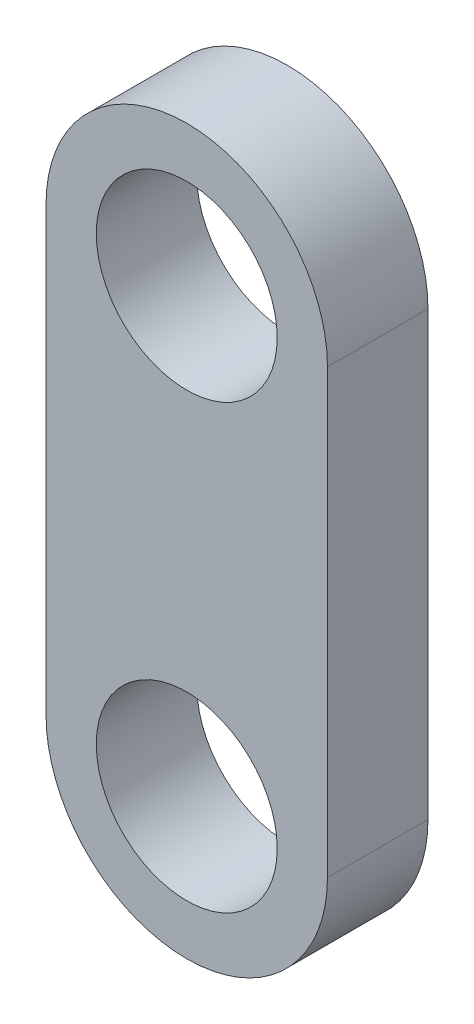
ISO-10303-21;
HEADER;
FILE_DESCRIPTION(('STEP AP214'),'2;1');
FILE_NAME('part.step','',(''),(''),'','','');
FILE_SCHEMA(('AUTOMOTIVE_DESIGN { 1 0 10303 214 1 1 1 1 }'));
ENDSEC;
DATA;
#1=APPLICATION_CONTEXT('core data for automotive mechanical design processes');
#2=APPLICATION_PROTOCOL_DEFINITION('international standard','automotive_design',2000,#1);
#3=PRODUCT_CONTEXT('',#1,'mechanical');
#4=PRODUCT('Part','Part','',(#3));
#5=PRODUCT_RELATED_PRODUCT_CATEGORY('part','',(#4));
#6=PRODUCT_DEFINITION_FORMATION('','',#4);
#7=PRODUCT_DEFINITION_CONTEXT('part definition',#1,'design');
#8=PRODUCT_DEFINITION('design','',#6,#7);
#9=PRODUCT_DEFINITION_SHAPE('','',#8);
#10=(LENGTH_UNIT() NAMED_UNIT(*) SI_UNIT(.MILLI.,.METRE.));
#11=(NAMED_UNIT(*) PLANE_ANGLE_UNIT() SI_UNIT($,.RADIAN.));
#12=(NAMED_UNIT(*) SI_UNIT($,.STERADIAN.) SOLID_ANGLE_UNIT());
#13=UNCERTAINTY_MEASURE_WITH_UNIT(LENGTH_MEASURE(1.E-05),#10,'distance_accuracy_value','');
#14=(GEOMETRIC_REPRESENTATION_CONTEXT(3) GLOBAL_UNCERTAINTY_ASSIGNED_CONTEXT((#13)) GLOBAL_UNIT_ASSIGNED_CONTEXT((#10,
#11,#12)) REPRESENTATION_CONTEXT('',''));
#15=CARTESIAN_POINT('',(0.,0.,0.));
#16=DIRECTION('',(0.,0.,1.));
#17=DIRECTION('',(1.,0.,0.));
#18=AXIS2_PLACEMENT_3D('',#15,#16,#17);
#19=CARTESIAN_POINT('',(0.,0.,2.5));
#20=DIRECTION('',(0.,0.,1.));
#21=DIRECTION('',(1.,0.,0.));
#22=AXIS2_PLACEMENT_3D('',#19,#20,#21);
#23=PLANE('',#22);
#24=CARTESIAN_POINT('',(0.,0.,2.5));
#25=DIRECTION('',(0.,0.,1.));
#26=DIRECTION('',(1.,0.,0.));
#27=AXIS2_PLACEMENT_3D('',#24,#25,#26);
#28=CIRCLE('',#27,2.25);
#29=CARTESIAN_POINT('',(2.25,0.,2.5));
#30=VERTEX_POINT('',#29);
#31=EDGE_CURVE('E112',#30,#30,#28,.T.);
#32=ORIENTED_EDGE('',*,*,#31,.F.);
#33=EDGE_LOOP('',(#32));
#34=FACE_BOUND('',#33,.T.);
#35=CARTESIAN_POINT('',(0.,0.,2.5));
#36=DIRECTION('',(0.,0.,1.));
#37=DIRECTION('',(1.,0.,0.));
#38=AXIS2_PLACEMENT_3D('',#35,#36,#37);
#39=CIRCLE('',#38,3.5);
#40=CARTESIAN_POINT('',(3.5,0.,2.5));
#41=VERTEX_POINT('',#40);
#42=CARTESIAN_POINT('',(-3.5,0.,2.5));
#43=VERTEX_POINT('',#42);
#44=EDGE_CURVE('E92',#41,#43,#39,.T.);
#45=ORIENTED_EDGE('',*,*,#44,.T.);
#46=DIRECTION('',(0.,-1.,0.));
#47=VECTOR('',#46,1.);
#48=CARTESIAN_POINT('',(-3.5,0.,2.5));
#49=LINE('',#48,#47);
#50=CARTESIAN_POINT('',(-3.5,-11.,2.5));
#51=VERTEX_POINT('',#50);
#52=EDGE_CURVE('E87',#43,#51,#49,.T.);
#53=ORIENTED_EDGE('',*,*,#52,.T.);
#54=CARTESIAN_POINT('',(0.,-11.,2.5));
#55=DIRECTION('',(0.,0.,1.));
#56=DIRECTION('',(-1.,0.,0.));
#57=AXIS2_PLACEMENT_3D('',#54,#55,#56);
#58=CIRCLE('',#57,3.5);
#59=CARTESIAN_POINT('',(3.5,-11.,2.5));
#60=VERTEX_POINT('',#59);
#61=EDGE_CURVE('E90',#51,#60,#58,.T.);
#62=ORIENTED_EDGE('',*,*,#61,.T.);
#63=DIRECTION('',(0.,1.,0.));
#64=VECTOR('',#63,1.);
#65=CARTESIAN_POINT('',(3.5,-11.,2.5));
#66=LINE('',#65,#64);
#67=EDGE_CURVE('E57',#60,#41,#66,.T.);
#68=ORIENTED_EDGE('',*,*,#67,.T.);
#69=EDGE_LOOP('',(#45,#53,#62,#68));
#70=FACE_BOUND('',#69,.T.);
#71=CARTESIAN_POINT('',(0.,-11.,2.5));
#72=DIRECTION('',(0.,0.,1.));
#73=DIRECTION('',(1.,0.,0.));
#74=AXIS2_PLACEMENT_3D('',#71,#72,#73);
#75=CIRCLE('',#74,2.25);
#76=CARTESIAN_POINT('',(2.25,-11.,2.5));
#77=VERTEX_POINT('',#76);
#78=EDGE_CURVE('E134',#77,#77,#75,.T.);
#79=ORIENTED_EDGE('',*,*,#78,.F.);
#80=EDGE_LOOP('',(#79));
#81=FACE_BOUND('',#80,.T.);
#82=ADVANCED_FACE('F39',(#34,#70,#81),#23,.T.);
#83=CARTESIAN_POINT('',(0.,0.,0.));
#84=DIRECTION('',(0.,0.,1.));
#85=DIRECTION('',(1.,0.,0.));
#86=AXIS2_PLACEMENT_3D('',#83,#84,#85);
#87=PLANE('',#86);
#88=CARTESIAN_POINT('',(0.,0.,0.));
#89=DIRECTION('',(0.,0.,1.));
#90=DIRECTION('',(1.,0.,0.));
#91=AXIS2_PLACEMENT_3D('',#88,#89,#90);
#92=CIRCLE('',#91,3.5);
#93=CARTESIAN_POINT('',(3.5,0.,0.));
#94=VERTEX_POINT('',#93);
#95=CARTESIAN_POINT('',(-3.5,0.,0.));
#96=VERTEX_POINT('',#95);
#97=EDGE_CURVE('E108',#94,#96,#92,.T.);
#98=ORIENTED_EDGE('',*,*,#97,.F.);
#99=DIRECTION('',(0.,1.,0.));
#100=VECTOR('',#99,1.);
#101=CARTESIAN_POINT('',(3.5,-11.,0.));
#102=LINE('',#101,#100);
#103=CARTESIAN_POINT('',(3.5,-11.,0.));
#104=VERTEX_POINT('',#103);
#105=EDGE_CURVE('E80',#104,#94,#102,.T.);
#106=ORIENTED_EDGE('',*,*,#105,.F.);
#107=CARTESIAN_POINT('',(0.,-11.,0.));
#108=DIRECTION('',(0.,0.,1.));
#109=DIRECTION('',(-1.,0.,0.));
#110=AXIS2_PLACEMENT_3D('',#107,#108,#109);
#111=CIRCLE('',#110,3.5);
#112=CARTESIAN_POINT('',(-3.5,-11.,0.));
#113=VERTEX_POINT('',#112);
#114=EDGE_CURVE('E74',#113,#104,#111,.T.);
#115=ORIENTED_EDGE('',*,*,#114,.F.);
#116=DIRECTION('',(0.,-1.,0.));
#117=VECTOR('',#116,1.);
#118=CARTESIAN_POINT('',(-3.5,0.,0.));
#119=LINE('',#118,#117);
#120=EDGE_CURVE('E97',#96,#113,#119,.T.);
#121=ORIENTED_EDGE('',*,*,#120,.F.);
#122=EDGE_LOOP('',(#98,#106,#115,#121));
#123=FACE_BOUND('',#122,.T.);
#124=CARTESIAN_POINT('',(0.,0.,0.));
#125=DIRECTION('',(0.,0.,1.));
#126=DIRECTION('',(1.,0.,0.));
#127=AXIS2_PLACEMENT_3D('',#124,#125,#126);
#128=CIRCLE('',#127,2.25);
#129=CARTESIAN_POINT('',(2.25,0.,0.));
#130=VERTEX_POINT('',#129);
#131=EDGE_CURVE('E130',#130,#130,#128,.T.);
#132=ORIENTED_EDGE('',*,*,#131,.T.);
#133=EDGE_LOOP('',(#132));
#134=FACE_BOUND('',#133,.T.);
#135=CARTESIAN_POINT('',(0.,-11.,0.));
#136=DIRECTION('',(0.,0.,1.));
#137=DIRECTION('',(1.,0.,0.));
#138=AXIS2_PLACEMENT_3D('',#135,#136,#137);
#139=CIRCLE('',#138,2.25);
#140=CARTESIAN_POINT('',(2.25,-11.,0.));
#141=VERTEX_POINT('',#140);
#142=EDGE_CURVE('E138',#141,#141,#139,.T.);
#143=ORIENTED_EDGE('',*,*,#142,.T.);
#144=EDGE_LOOP('',(#143));
#145=FACE_BOUND('',#144,.T.);
#146=ADVANCED_FACE('F125',(#123,#134,#145),#87,.F.);
#147=CARTESIAN_POINT('',(0.,0.,2.5));
#148=DIRECTION('',(0.,0.,-1.));
#149=DIRECTION('',(-1.,0.,0.));
#150=AXIS2_PLACEMENT_3D('',#147,#148,#149);
#151=CYLINDRICAL_SURFACE('',#150,3.5);
#152=ORIENTED_EDGE('',*,*,#97,.T.);
#153=DIRECTION('',(0.,0.,-1.));
#154=VECTOR('',#153,1.);
#155=CARTESIAN_POINT('',(-3.5,0.,2.5));
#156=LINE('',#155,#154);
#157=EDGE_CURVE('E11',#43,#96,#156,.T.);
#158=ORIENTED_EDGE('',*,*,#157,.F.);
#159=ORIENTED_EDGE('',*,*,#44,.F.);
#160=DIRECTION('',(0.,0.,-1.));
#161=VECTOR('',#160,1.);
#162=CARTESIAN_POINT('',(3.5,0.,2.5));
#163=LINE('',#162,#161);
#164=EDGE_CURVE('E104',#41,#94,#163,.T.);
#165=ORIENTED_EDGE('',*,*,#164,.T.);
#166=EDGE_LOOP('',(#152,#158,#159,#165));
#167=FACE_BOUND('',#166,.T.);
#168=ADVANCED_FACE('F41',(#167),#151,.T.);
#169=CARTESIAN_POINT('',(-3.5,0.,2.5));
#170=DIRECTION('',(1.,0.,0.));
#171=DIRECTION('',(0.,1.,0.));
#172=AXIS2_PLACEMENT_3D('',#169,#170,#171);
#173=PLANE('',#172);
#174=ORIENTED_EDGE('',*,*,#120,.T.);
#175=DIRECTION('',(0.,0.,-1.));
#176=VECTOR('',#175,1.);
#177=CARTESIAN_POINT('',(-3.5,-11.,2.5));
#178=LINE('',#177,#176);
#179=EDGE_CURVE('E49',#51,#113,#178,.T.);
#180=ORIENTED_EDGE('',*,*,#179,.F.);
#181=ORIENTED_EDGE('',*,*,#52,.F.);
#182=ORIENTED_EDGE('',*,*,#157,.T.);
#183=EDGE_LOOP('',(#174,#180,#181,#182));
#184=FACE_BOUND('',#183,.T.);
#185=ADVANCED_FACE('F96',(#184),#173,.F.);
#186=CARTESIAN_POINT('',(0.,-11.,2.5));
#187=DIRECTION('',(0.,0.,-1.));
#188=DIRECTION('',(-1.,0.,0.));
#189=AXIS2_PLACEMENT_3D('',#186,#187,#188);
#190=CYLINDRICAL_SURFACE('',#189,3.5);
#191=ORIENTED_EDGE('',*,*,#114,.T.);
#192=DIRECTION('',(0.,0.,-1.));
#193=VECTOR('',#192,1.);
#194=CARTESIAN_POINT('',(3.5,-11.,2.5));
#195=LINE('',#194,#193);
#196=EDGE_CURVE('E99',#60,#104,#195,.T.);
#197=ORIENTED_EDGE('',*,*,#196,.F.);
#198=ORIENTED_EDGE('',*,*,#61,.F.);
#199=ORIENTED_EDGE('',*,*,#179,.T.);
#200=EDGE_LOOP('',(#191,#197,#198,#199));
#201=FACE_BOUND('',#200,.T.);
#202=ADVANCED_FACE('F100',(#201),#190,.T.);
#203=CARTESIAN_POINT('',(3.5,-11.,2.5));
#204=DIRECTION('',(-1.,0.,0.));
#205=DIRECTION('',(0.,0.,1.));
#206=AXIS2_PLACEMENT_3D('',#203,#204,#205);
#207=PLANE('',#206);
#208=ORIENTED_EDGE('',*,*,#105,.T.);
#209=ORIENTED_EDGE('',*,*,#164,.F.);
#210=ORIENTED_EDGE('',*,*,#67,.F.);
#211=ORIENTED_EDGE('',*,*,#196,.T.);
#212=EDGE_LOOP('',(#208,#209,#210,#211));
#213=FACE_BOUND('',#212,.T.);
#214=ADVANCED_FACE('F122',(#213),#207,.F.);
#215=CARTESIAN_POINT('',(0.,0.,2.5));
#216=DIRECTION('',(0.,0.,-1.));
#217=DIRECTION('',(-1.,0.,0.));
#218=AXIS2_PLACEMENT_3D('',#215,#216,#217);
#219=CYLINDRICAL_SURFACE('',#218,2.25);
#220=ORIENTED_EDGE('',*,*,#31,.T.);
#221=EDGE_LOOP('',(#220));
#222=FACE_BOUND('',#221,.T.);
#223=ORIENTED_EDGE('',*,*,#131,.F.);
#224=EDGE_LOOP('',(#223));
#225=FACE_BOUND('',#224,.T.);
#226=ADVANCED_FACE('F157',(#222,#225),#219,.F.);
#227=CARTESIAN_POINT('',(0.,-11.,2.5));
#228=DIRECTION('',(0.,0.,-1.));
#229=DIRECTION('',(-1.,0.,0.));
#230=AXIS2_PLACEMENT_3D('',#227,#228,#229);
#231=CYLINDRICAL_SURFACE('',#230,2.25);
#232=ORIENTED_EDGE('',*,*,#78,.T.);
#233=EDGE_LOOP('',(#232));
#234=FACE_BOUND('',#233,.T.);
#235=ORIENTED_EDGE('',*,*,#142,.F.);
#236=EDGE_LOOP('',(#235));
#237=FACE_BOUND('',#236,.T.);
#238=ADVANCED_FACE('F146',(#234,#237),#231,.F.);
#239=CLOSED_SHELL('',(#82,#146,#168,#185,#202,#214,#226,#238));
#240=MANIFOLD_SOLID_BREP('B2',#239);
#241=ADVANCED_BREP_SHAPE_REPRESENTATION('',(#18,#240),#14);
#242=SHAPE_DEFINITION_REPRESENTATION(#9,#241);
ENDSEC;
END-ISO-10303-21;
